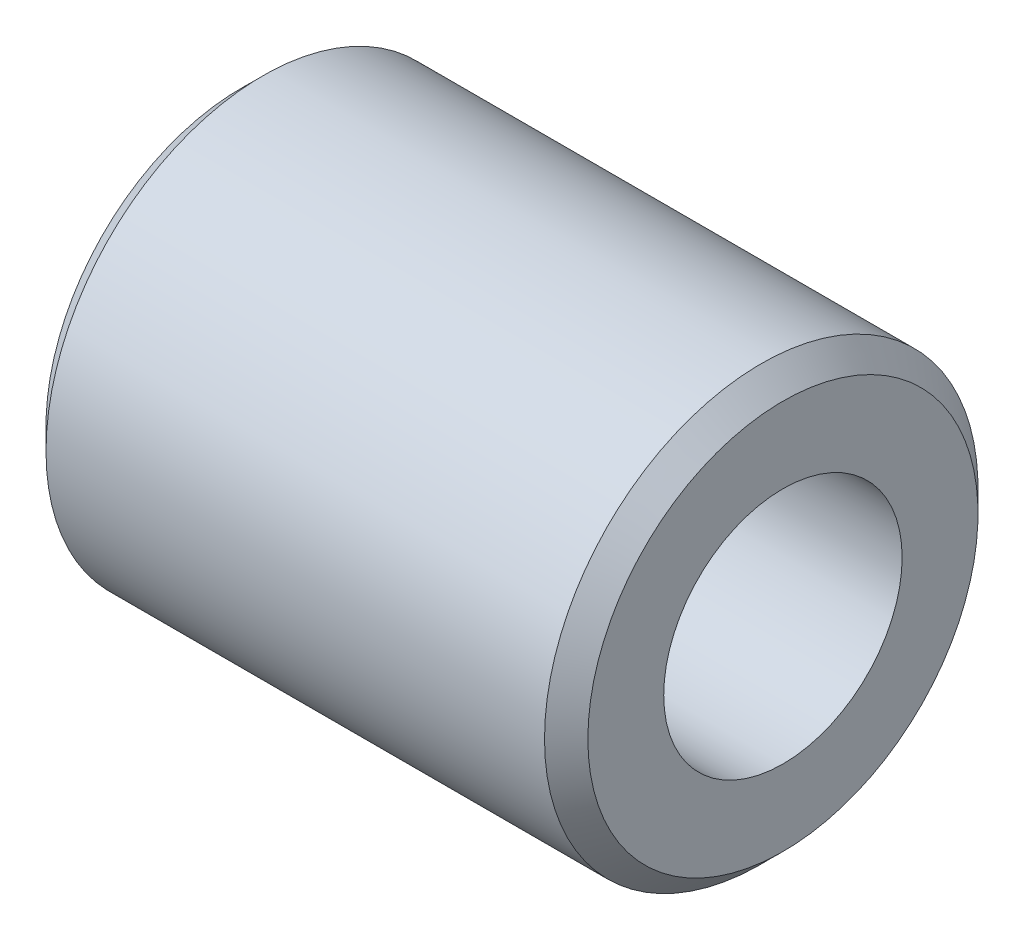
ISO-10303-21;
HEADER;
FILE_DESCRIPTION(('STEP AP214'),'2;1');
FILE_NAME('part.step','',(''),(''),'','','');
FILE_SCHEMA(('AUTOMOTIVE_DESIGN { 1 0 10303 214 1 1 1 1 }'));
ENDSEC;
DATA;
#1=APPLICATION_CONTEXT('core data for automotive mechanical design processes');
#2=APPLICATION_PROTOCOL_DEFINITION('international standard','automotive_design',2000,#1);
#3=PRODUCT_CONTEXT('',#1,'mechanical');
#4=PRODUCT('Part','Part','',(#3));
#5=PRODUCT_RELATED_PRODUCT_CATEGORY('part','',(#4));
#6=PRODUCT_DEFINITION_FORMATION('','',#4);
#7=PRODUCT_DEFINITION_CONTEXT('part definition',#1,'design');
#8=PRODUCT_DEFINITION('design','',#6,#7);
#9=PRODUCT_DEFINITION_SHAPE('','',#8);
#10=(LENGTH_UNIT() NAMED_UNIT(*) SI_UNIT(.MILLI.,.METRE.));
#11=(NAMED_UNIT(*) PLANE_ANGLE_UNIT() SI_UNIT($,.RADIAN.));
#12=(NAMED_UNIT(*) SI_UNIT($,.STERADIAN.) SOLID_ANGLE_UNIT());
#13=UNCERTAINTY_MEASURE_WITH_UNIT(LENGTH_MEASURE(1.E-05),#10,'distance_accuracy_value','');
#14=(GEOMETRIC_REPRESENTATION_CONTEXT(3) GLOBAL_UNCERTAINTY_ASSIGNED_CONTEXT((#13)) GLOBAL_UNIT_ASSIGNED_CONTEXT((#10,
#11,#12)) REPRESENTATION_CONTEXT('',''));
#15=CARTESIAN_POINT('',(0.,0.,0.));
#16=DIRECTION('',(0.,0.,1.));
#17=DIRECTION('',(1.,0.,0.));
#18=AXIS2_PLACEMENT_3D('',#15,#16,#17);
#19=CARTESIAN_POINT('',(83.,0.,0.));
#20=DIRECTION('',(1.,0.,0.));
#21=DIRECTION('',(0.,0.,-1.));
#22=AXIS2_PLACEMENT_3D('',#19,#20,#21);
#23=PLANE('',#22);
#24=CARTESIAN_POINT('',(83.,0.,0.));
#25=DIRECTION('',(-1.,0.,0.));
#26=DIRECTION('',(0.,0.,1.));
#27=AXIS2_PLACEMENT_3D('',#24,#25,#26);
#28=CIRCLE('',#27,27.5);
#29=CARTESIAN_POINT('',(83.,0.,27.5));
#30=VERTEX_POINT('',#29);
#31=EDGE_CURVE('E54',#30,#30,#28,.T.);
#32=ORIENTED_EDGE('',*,*,#31,.F.);
#33=EDGE_LOOP('',(#32));
#34=FACE_BOUND('',#33,.T.);
#35=CARTESIAN_POINT('',(83.,0.,0.));
#36=DIRECTION('',(-1.,0.,0.));
#37=DIRECTION('',(0.,0.,1.));
#38=AXIS2_PLACEMENT_3D('',#35,#36,#37);
#39=CIRCLE('',#38,30.);
#40=CARTESIAN_POINT('',(83.,0.,30.));
#41=VERTEX_POINT('',#40);
#42=EDGE_CURVE('E69',#41,#41,#39,.T.);
#43=ORIENTED_EDGE('',*,*,#42,.T.);
#44=EDGE_LOOP('',(#43));
#45=FACE_BOUND('',#44,.T.);
#46=ADVANCED_FACE('F34',(#34,#45),#23,.F.);
#47=CARTESIAN_POINT('',(0.,0.,0.));
#48=DIRECTION('',(-1.,0.,0.));
#49=DIRECTION('',(0.,0.,1.));
#50=AXIS2_PLACEMENT_3D('',#47,#48,#49);
#51=CYLINDRICAL_SURFACE('',#50,27.5);
#52=CARTESIAN_POINT('',(125.,0.,0.));
#53=DIRECTION('',(-1.,0.,0.));
#54=DIRECTION('',(0.,0.,1.));
#55=AXIS2_PLACEMENT_3D('',#52,#53,#54);
#56=CIRCLE('',#55,27.5);
#57=CARTESIAN_POINT('',(125.,0.,27.5));
#58=VERTEX_POINT('',#57);
#59=EDGE_CURVE('E57',#58,#58,#56,.T.);
#60=ORIENTED_EDGE('',*,*,#59,.F.);
#61=EDGE_LOOP('',(#60));
#62=FACE_BOUND('',#61,.T.);
#63=ORIENTED_EDGE('',*,*,#31,.T.);
#64=EDGE_LOOP('',(#63));
#65=FACE_BOUND('',#64,.T.);
#66=ADVANCED_FACE('F104',(#62,#65),#51,.F.);
#67=CARTESIAN_POINT('',(125.,0.,0.));
#68=DIRECTION('',(-1.,0.,0.));
#69=DIRECTION('',(0.,0.,1.));
#70=AXIS2_PLACEMENT_3D('',#67,#68,#69);
#71=PLANE('',#70);
#72=CARTESIAN_POINT('',(125.,0.,0.));
#73=DIRECTION('',(-1.,0.,0.));
#74=DIRECTION('',(0.,0.,1.));
#75=AXIS2_PLACEMENT_3D('',#72,#73,#74);
#76=CIRCLE('',#75,45.);
#77=CARTESIAN_POINT('',(125.,0.,45.));
#78=VERTEX_POINT('',#77);
#79=EDGE_CURVE('E41',#78,#78,#76,.F.);
#80=ORIENTED_EDGE('',*,*,#79,.T.);
#81=EDGE_LOOP('',(#80));
#82=FACE_BOUND('',#81,.T.);
#83=ORIENTED_EDGE('',*,*,#59,.T.);
#84=EDGE_LOOP('',(#83));
#85=FACE_BOUND('',#84,.T.);
#86=ADVANCED_FACE('F100',(#82,#85),#71,.F.);
#87=CARTESIAN_POINT('',(0.,0.,0.));
#88=DIRECTION('',(-1.,0.,0.));
#89=DIRECTION('',(0.,0.,1.));
#90=AXIS2_PLACEMENT_3D('',#87,#88,#89);
#91=CYLINDRICAL_SURFACE('',#90,50.);
#92=CARTESIAN_POINT('',(120.,0.,0.));
#93=DIRECTION('',(-1.,0.,0.));
#94=DIRECTION('',(0.,0.,1.));
#95=AXIS2_PLACEMENT_3D('',#92,#93,#94);
#96=CIRCLE('',#95,50.);
#97=CARTESIAN_POINT('',(120.,0.,50.));
#98=VERTEX_POINT('',#97);
#99=EDGE_CURVE('E45',#98,#98,#96,.T.);
#100=ORIENTED_EDGE('',*,*,#99,.T.);
#101=EDGE_LOOP('',(#100));
#102=FACE_BOUND('',#101,.T.);
#103=CARTESIAN_POINT('',(5.,0.,0.));
#104=DIRECTION('',(1.,0.,0.));
#105=DIRECTION('',(0.,0.,-1.));
#106=AXIS2_PLACEMENT_3D('',#103,#104,#105);
#107=CIRCLE('',#106,50.);
#108=CARTESIAN_POINT('',(5.,0.,-50.));
#109=VERTEX_POINT('',#108);
#110=EDGE_CURVE('E49',#109,#109,#107,.T.);
#111=ORIENTED_EDGE('',*,*,#110,.T.);
#112=EDGE_LOOP('',(#111));
#113=FACE_BOUND('',#112,.T.);
#114=ADVANCED_FACE('F95',(#102,#113),#91,.T.);
#115=CARTESIAN_POINT('',(0.,0.,0.));
#116=DIRECTION('',(1.,0.,0.));
#117=DIRECTION('',(0.,0.,-1.));
#118=AXIS2_PLACEMENT_3D('',#115,#116,#117);
#119=PLANE('',#118);
#120=CARTESIAN_POINT('',(0.,0.,0.));
#121=DIRECTION('',(1.,0.,0.));
#122=DIRECTION('',(0.,0.,-1.));
#123=AXIS2_PLACEMENT_3D('',#120,#121,#122);
#124=CIRCLE('',#123,45.);
#125=CARTESIAN_POINT('',(0.,0.,-45.0000000000001));
#126=VERTEX_POINT('',#125);
#127=EDGE_CURVE('E10',#126,#126,#124,.F.);
#128=ORIENTED_EDGE('',*,*,#127,.T.);
#129=EDGE_LOOP('',(#128));
#130=FACE_BOUND('',#129,.T.);
#131=CARTESIAN_POINT('',(0.,0.,0.));
#132=DIRECTION('',(-1.,0.,0.));
#133=DIRECTION('',(0.,0.,1.));
#134=AXIS2_PLACEMENT_3D('',#131,#132,#133);
#135=CIRCLE('',#134,27.5);
#136=CARTESIAN_POINT('',(0.,0.,27.5));
#137=VERTEX_POINT('',#136);
#138=EDGE_CURVE('E60',#137,#137,#135,.T.);
#139=ORIENTED_EDGE('',*,*,#138,.F.);
#140=EDGE_LOOP('',(#139));
#141=FACE_BOUND('',#140,.T.);
#142=ADVANCED_FACE('F90',(#130,#141),#119,.F.);
#143=CARTESIAN_POINT('',(0.,0.,0.));
#144=DIRECTION('',(-1.,0.,0.));
#145=DIRECTION('',(0.,0.,1.));
#146=AXIS2_PLACEMENT_3D('',#143,#144,#145);
#147=CYLINDRICAL_SURFACE('',#146,27.5);
#148=CARTESIAN_POINT('',(42.,0.,0.));
#149=DIRECTION('',(-1.,0.,0.));
#150=DIRECTION('',(0.,0.,1.));
#151=AXIS2_PLACEMENT_3D('',#148,#149,#150);
#152=CIRCLE('',#151,27.5);
#153=CARTESIAN_POINT('',(42.,0.,27.5));
#154=VERTEX_POINT('',#153);
#155=EDGE_CURVE('E63',#154,#154,#152,.T.);
#156=ORIENTED_EDGE('',*,*,#155,.F.);
#157=EDGE_LOOP('',(#156));
#158=FACE_BOUND('',#157,.T.);
#159=ORIENTED_EDGE('',*,*,#138,.T.);
#160=EDGE_LOOP('',(#159));
#161=FACE_BOUND('',#160,.T.);
#162=ADVANCED_FACE('F84',(#158,#161),#147,.F.);
#163=CARTESIAN_POINT('',(42.,0.,0.));
#164=DIRECTION('',(-1.,0.,0.));
#165=DIRECTION('',(0.,0.,1.));
#166=AXIS2_PLACEMENT_3D('',#163,#164,#165);
#167=PLANE('',#166);
#168=CARTESIAN_POINT('',(42.,0.,0.));
#169=DIRECTION('',(-1.,0.,0.));
#170=DIRECTION('',(0.,0.,1.));
#171=AXIS2_PLACEMENT_3D('',#168,#169,#170);
#172=CIRCLE('',#171,30.);
#173=CARTESIAN_POINT('',(42.,0.,30.));
#174=VERTEX_POINT('',#173);
#175=EDGE_CURVE('E66',#174,#174,#172,.T.);
#176=ORIENTED_EDGE('',*,*,#175,.F.);
#177=EDGE_LOOP('',(#176));
#178=FACE_BOUND('',#177,.T.);
#179=ORIENTED_EDGE('',*,*,#155,.T.);
#180=EDGE_LOOP('',(#179));
#181=FACE_BOUND('',#180,.T.);
#182=ADVANCED_FACE('F78',(#178,#181),#167,.F.);
#183=CARTESIAN_POINT('',(0.,0.,0.));
#184=DIRECTION('',(-1.,0.,0.));
#185=DIRECTION('',(0.,0.,1.));
#186=AXIS2_PLACEMENT_3D('',#183,#184,#185);
#187=CYLINDRICAL_SURFACE('',#186,30.);
#188=ORIENTED_EDGE('',*,*,#42,.F.);
#189=EDGE_LOOP('',(#188));
#190=FACE_BOUND('',#189,.T.);
#191=ORIENTED_EDGE('',*,*,#175,.T.);
#192=EDGE_LOOP('',(#191));
#193=FACE_BOUND('',#192,.T.);
#194=ADVANCED_FACE('F74',(#190,#193),#187,.F.);
#195=CARTESIAN_POINT('',(120.,0.,0.));
#196=DIRECTION('',(-1.,0.,0.));
#197=DIRECTION('',(0.,0.,1.));
#198=AXIS2_PLACEMENT_3D('',#195,#196,#197);
#199=CONICAL_SURFACE('',#198,50.,0.78539816339745);
#200=ORIENTED_EDGE('',*,*,#79,.F.);
#201=EDGE_LOOP('',(#200));
#202=FACE_BOUND('',#201,.T.);
#203=ORIENTED_EDGE('',*,*,#99,.F.);
#204=EDGE_LOOP('',(#203));
#205=FACE_BOUND('',#204,.T.);
#206=ADVANCED_FACE('F77',(#202,#205),#199,.T.);
#207=CARTESIAN_POINT('',(0.,0.,0.));
#208=DIRECTION('',(1.,0.,0.));
#209=DIRECTION('',(0.,0.,-1.));
#210=AXIS2_PLACEMENT_3D('',#207,#208,#209);
#211=CONICAL_SURFACE('',#210,45.,0.785398163397445);
#212=ORIENTED_EDGE('',*,*,#110,.F.);
#213=EDGE_LOOP('',(#212));
#214=FACE_BOUND('',#213,.T.);
#215=ORIENTED_EDGE('',*,*,#127,.F.);
#216=EDGE_LOOP('',(#215));
#217=FACE_BOUND('',#216,.T.);
#218=ADVANCED_FACE('F36',(#214,#217),#211,.T.);
#219=CLOSED_SHELL('',(#46,#66,#86,#114,#142,#162,#182,#194,#206,#218));
#220=MANIFOLD_SOLID_BREP('B2',#219);
#221=ADVANCED_BREP_SHAPE_REPRESENTATION('',(#18,#220),#14);
#222=SHAPE_DEFINITION_REPRESENTATION(#9,#221);
ENDSEC;
END-ISO-10303-21;
